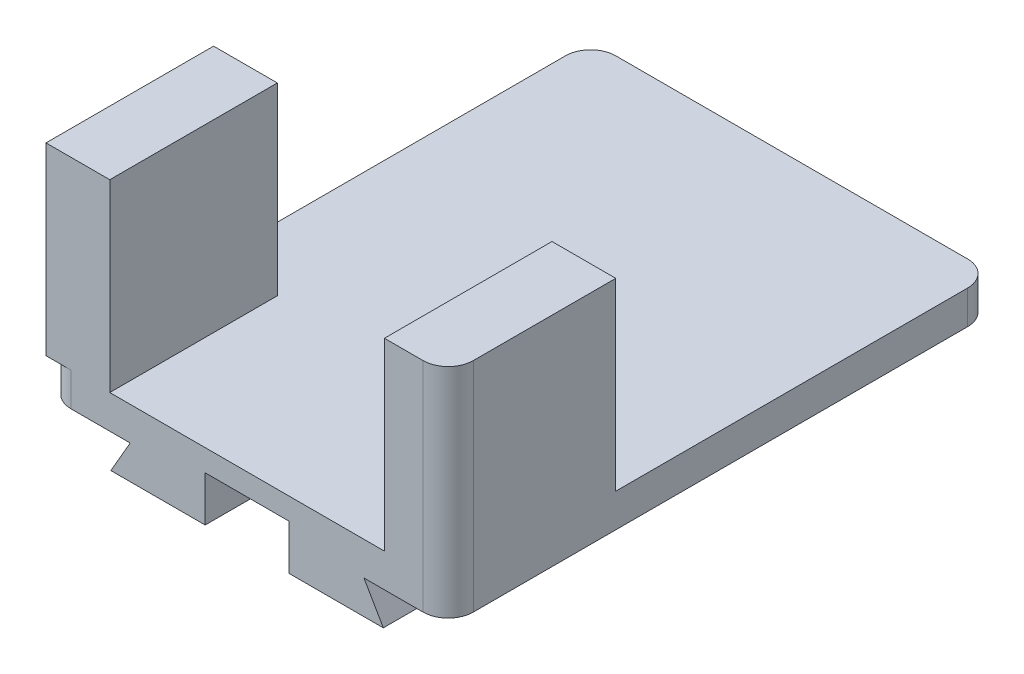
ISO-10303-21;
HEADER;
FILE_DESCRIPTION(('STEP AP214'),'2;1');
FILE_NAME('part.step','',(''),(''),'','','');
FILE_SCHEMA(('AUTOMOTIVE_DESIGN { 1 0 10303 214 1 1 1 1 }'));
ENDSEC;
DATA;
#1=APPLICATION_CONTEXT('core data for automotive mechanical design processes');
#2=APPLICATION_PROTOCOL_DEFINITION('international standard','automotive_design',2000,#1);
#3=PRODUCT_CONTEXT('',#1,'mechanical');
#4=PRODUCT('Part','Part','',(#3));
#5=PRODUCT_RELATED_PRODUCT_CATEGORY('part','',(#4));
#6=PRODUCT_DEFINITION_FORMATION('','',#4);
#7=PRODUCT_DEFINITION_CONTEXT('part definition',#1,'design');
#8=PRODUCT_DEFINITION('design','',#6,#7);
#9=PRODUCT_DEFINITION_SHAPE('','',#8);
#10=(LENGTH_UNIT() NAMED_UNIT(*) SI_UNIT(.MILLI.,.METRE.));
#11=(NAMED_UNIT(*) PLANE_ANGLE_UNIT() SI_UNIT($,.RADIAN.));
#12=(NAMED_UNIT(*) SI_UNIT($,.STERADIAN.) SOLID_ANGLE_UNIT());
#13=UNCERTAINTY_MEASURE_WITH_UNIT(LENGTH_MEASURE(1.E-05),#10,'distance_accuracy_value','');
#14=(GEOMETRIC_REPRESENTATION_CONTEXT(3) GLOBAL_UNCERTAINTY_ASSIGNED_CONTEXT((#13)) GLOBAL_UNIT_ASSIGNED_CONTEXT((#10,
#11,#12)) REPRESENTATION_CONTEXT('',''));
#15=CARTESIAN_POINT('',(0.,0.,0.));
#16=DIRECTION('',(0.,0.,1.));
#17=DIRECTION('',(1.,0.,0.));
#18=AXIS2_PLACEMENT_3D('',#15,#16,#17);
#19=CARTESIAN_POINT('',(0.,0.,82.55));
#20=DIRECTION('',(0.,-1.,0.));
#21=DIRECTION('',(0.,0.,-1.));
#22=AXIS2_PLACEMENT_3D('',#19,#20,#21);
#23=PLANE('',#22);
#24=DIRECTION('',(1.,0.,0.));
#25=VECTOR('',#24,1.);
#26=CARTESIAN_POINT('',(-30.48,0.,57.15));
#27=LINE('',#26,#25);
#28=CARTESIAN_POINT('',(-30.48,0.,57.15));
#29=VERTEX_POINT('',#28);
#30=CARTESIAN_POINT('',(-20.8153,0.,57.15));
#31=VERTEX_POINT('',#30);
#32=EDGE_CURVE('E48',#29,#31,#27,.T.);
#33=ORIENTED_EDGE('',*,*,#32,.T.);
#34=DIRECTION('',(0.,0.,1.));
#35=VECTOR('',#34,1.);
#36=CARTESIAN_POINT('',(-20.8153,0.,82.55));
#37=LINE('',#36,#35);
#38=CARTESIAN_POINT('',(-20.8153,0.,82.55));
#39=VERTEX_POINT('',#38);
#40=EDGE_CURVE('E223',#31,#39,#37,.T.);
#41=ORIENTED_EDGE('',*,*,#40,.T.);
#42=DIRECTION('',(-1.,0.,0.));
#43=VECTOR('',#42,1.);
#44=CARTESIAN_POINT('',(-30.48,0.,82.55));
#45=LINE('',#44,#43);
#46=CARTESIAN_POINT('',(20.8153,0.,82.55));
#47=VERTEX_POINT('',#46);
#48=EDGE_CURVE('E305',#47,#39,#45,.T.);
#49=ORIENTED_EDGE('',*,*,#48,.F.);
#50=DIRECTION('',(0.,0.,1.));
#51=VECTOR('',#50,1.);
#52=CARTESIAN_POINT('',(20.8153,0.,82.55));
#53=LINE('',#52,#51);
#54=CARTESIAN_POINT('',(20.8153,0.,57.15));
#55=VERTEX_POINT('',#54);
#56=EDGE_CURVE('E233',#55,#47,#53,.T.);
#57=ORIENTED_EDGE('',*,*,#56,.F.);
#58=DIRECTION('',(-1.,0.,0.));
#59=VECTOR('',#58,1.);
#60=CARTESIAN_POINT('',(30.48,0.,57.15));
#61=LINE('',#60,#59);
#62=CARTESIAN_POINT('',(30.48,0.,57.15));
#63=VERTEX_POINT('',#62);
#64=EDGE_CURVE('E198',#63,#55,#61,.T.);
#65=ORIENTED_EDGE('',*,*,#64,.F.);
#66=DIRECTION('',(0.,0.,-1.));
#67=VECTOR('',#66,1.);
#68=CARTESIAN_POINT('',(30.48,0.,82.55));
#69=LINE('',#68,#67);
#70=CARTESIAN_POINT('',(30.48,0.,3.80999999999999));
#71=VERTEX_POINT('',#70);
#72=EDGE_CURVE('E309',#63,#71,#69,.T.);
#73=ORIENTED_EDGE('',*,*,#72,.T.);
#74=CARTESIAN_POINT('',(26.67,0.,3.80999999999999));
#75=DIRECTION('',(0.,-1.,0.));
#76=DIRECTION('',(0.,0.,-1.));
#77=AXIS2_PLACEMENT_3D('',#74,#75,#76);
#78=CIRCLE('',#77,3.81);
#79=CARTESIAN_POINT('',(26.67,0.,0.));
#80=VERTEX_POINT('',#79);
#81=EDGE_CURVE('E277',#71,#80,#78,.F.);
#82=ORIENTED_EDGE('',*,*,#81,.T.);
#83=DIRECTION('',(-1.,0.,0.));
#84=VECTOR('',#83,1.);
#85=CARTESIAN_POINT('',(0.,0.,0.));
#86=LINE('',#85,#84);
#87=CARTESIAN_POINT('',(-26.67,0.,0.));
#88=VERTEX_POINT('',#87);
#89=EDGE_CURVE('E308',#80,#88,#86,.T.);
#90=ORIENTED_EDGE('',*,*,#89,.T.);
#91=CARTESIAN_POINT('',(-26.67,0.,3.80999999999999));
#92=DIRECTION('',(0.,-1.,0.));
#93=DIRECTION('',(0.,0.,-1.));
#94=AXIS2_PLACEMENT_3D('',#91,#92,#93);
#95=CIRCLE('',#94,3.81);
#96=CARTESIAN_POINT('',(-30.48,0.,3.80999999999999));
#97=VERTEX_POINT('',#96);
#98=EDGE_CURVE('E272',#88,#97,#95,.F.);
#99=ORIENTED_EDGE('',*,*,#98,.T.);
#100=DIRECTION('',(0.,0.,-1.));
#101=VECTOR('',#100,1.);
#102=CARTESIAN_POINT('',(-30.48,0.,82.55));
#103=LINE('',#102,#101);
#104=EDGE_CURVE('E53',#29,#97,#103,.T.);
#105=ORIENTED_EDGE('',*,*,#104,.F.);
#106=EDGE_LOOP('',(#33,#41,#49,#57,#65,#73,#82,#90,#99,#105));
#107=FACE_BOUND('',#106,.T.);
#108=ADVANCED_FACE('F33',(#107),#23,.F.);
#109=CARTESIAN_POINT('',(-30.48,-5.08,82.55));
#110=DIRECTION('',(1.,0.,0.));
#111=DIRECTION('',(0.,0.,-1.));
#112=AXIS2_PLACEMENT_3D('',#109,#110,#111);
#113=PLANE('',#112);
#114=DIRECTION('',(0.,0.,-1.));
#115=VECTOR('',#114,1.);
#116=CARTESIAN_POINT('',(-30.48,-5.08,82.55));
#117=LINE('',#116,#115);
#118=CARTESIAN_POINT('',(-30.48,-5.08,78.74));
#119=VERTEX_POINT('',#118);
#120=CARTESIAN_POINT('',(-30.48,-5.08,3.80999999999999));
#121=VERTEX_POINT('',#120);
#122=EDGE_CURVE('E289',#119,#121,#117,.T.);
#123=ORIENTED_EDGE('',*,*,#122,.F.);
#124=DIRECTION('',(0.,-1.,0.));
#125=VECTOR('',#124,1.);
#126=CARTESIAN_POINT('',(-30.48,-5.08,78.74));
#127=LINE('',#126,#125);
#128=CARTESIAN_POINT('',(-30.48,0.,78.74));
#129=VERTEX_POINT('',#128);
#130=EDGE_CURVE('E11',#119,#129,#127,.F.);
#131=ORIENTED_EDGE('',*,*,#130,.T.);
#132=DIRECTION('',(0.,0.,-1.));
#133=VECTOR('',#132,1.);
#134=CARTESIAN_POINT('',(-30.48,0.,82.55));
#135=LINE('',#134,#133);
#136=CARTESIAN_POINT('',(-30.48,0.,82.55));
#137=VERTEX_POINT('',#136);
#138=EDGE_CURVE('E194',#137,#129,#135,.T.);
#139=ORIENTED_EDGE('',*,*,#138,.F.);
#140=DIRECTION('',(0.,-1.,0.));
#141=VECTOR('',#140,1.);
#142=CARTESIAN_POINT('',(-30.48,27.94,82.55));
#143=LINE('',#142,#141);
#144=CARTESIAN_POINT('',(-30.48,27.94,82.55));
#145=VERTEX_POINT('',#144);
#146=EDGE_CURVE('E187',#145,#137,#143,.T.);
#147=ORIENTED_EDGE('',*,*,#146,.F.);
#148=DIRECTION('',(0.,0.,-1.));
#149=VECTOR('',#148,1.);
#150=CARTESIAN_POINT('',(-30.48,27.94,82.55));
#151=LINE('',#150,#149);
#152=CARTESIAN_POINT('',(-30.48,27.94,57.15));
#153=VERTEX_POINT('',#152);
#154=EDGE_CURVE('E191',#145,#153,#151,.T.);
#155=ORIENTED_EDGE('',*,*,#154,.T.);
#156=DIRECTION('',(0.,-1.,0.));
#157=VECTOR('',#156,1.);
#158=CARTESIAN_POINT('',(-30.48,27.94,57.15));
#159=LINE('',#158,#157);
#160=EDGE_CURVE('E219',#153,#29,#159,.T.);
#161=ORIENTED_EDGE('',*,*,#160,.T.);
#162=ORIENTED_EDGE('',*,*,#104,.T.);
#163=DIRECTION('',(0.,-1.,0.));
#164=VECTOR('',#163,1.);
#165=CARTESIAN_POINT('',(-30.48,-5.08,3.80999999999999));
#166=LINE('',#165,#164);
#167=EDGE_CURVE('E41',#97,#121,#166,.T.);
#168=ORIENTED_EDGE('',*,*,#167,.T.);
#169=EDGE_LOOP('',(#123,#131,#139,#147,#155,#161,#162,#168));
#170=FACE_BOUND('',#169,.T.);
#171=ADVANCED_FACE('F190',(#170),#113,.F.);
#172=CARTESIAN_POINT('',(-30.48,-5.08,82.55));
#173=DIRECTION('',(0.,1.,0.));
#174=DIRECTION('',(0.,0.,1.));
#175=AXIS2_PLACEMENT_3D('',#172,#173,#174);
#176=PLANE('',#175);
#177=DIRECTION('',(1.,0.,0.));
#178=VECTOR('',#177,1.);
#179=CARTESIAN_POINT('',(-30.48,-5.08,82.55));
#180=LINE('',#179,#178);
#181=CARTESIAN_POINT('',(-26.67,-5.08,82.55));
#182=VERTEX_POINT('',#181);
#183=CARTESIAN_POINT('',(-17.7172606325165,-5.08,82.55));
#184=VERTEX_POINT('',#183);
#185=EDGE_CURVE('E307',#182,#184,#180,.T.);
#186=ORIENTED_EDGE('',*,*,#185,.F.);
#187=CARTESIAN_POINT('',(-26.67,-5.08,78.74));
#188=DIRECTION('',(0.,1.,0.));
#189=DIRECTION('',(0.,0.,1.));
#190=AXIS2_PLACEMENT_3D('',#187,#188,#189);
#191=CIRCLE('',#190,3.81);
#192=EDGE_CURVE('E285',#182,#119,#191,.F.);
#193=ORIENTED_EDGE('',*,*,#192,.T.);
#194=ORIENTED_EDGE('',*,*,#122,.T.);
#195=CARTESIAN_POINT('',(-26.67,-5.08,3.80999999999999));
#196=DIRECTION('',(0.,1.,0.));
#197=DIRECTION('',(0.,0.,1.));
#198=AXIS2_PLACEMENT_3D('',#195,#196,#197);
#199=CIRCLE('',#198,3.81);
#200=CARTESIAN_POINT('',(-26.67,-5.08,0.));
#201=VERTEX_POINT('',#200);
#202=EDGE_CURVE('E283',#121,#201,#199,.F.);
#203=ORIENTED_EDGE('',*,*,#202,.T.);
#204=DIRECTION('',(1.,0.,0.));
#205=VECTOR('',#204,1.);
#206=CARTESIAN_POINT('',(-30.48,-5.08,0.));
#207=LINE('',#206,#205);
#208=CARTESIAN_POINT('',(-17.7172606325165,-5.08,0.));
#209=VERTEX_POINT('',#208);
#210=EDGE_CURVE('E331',#201,#209,#207,.T.);
#211=ORIENTED_EDGE('',*,*,#210,.T.);
#212=DIRECTION('',(0.,0.,-1.));
#213=VECTOR('',#212,1.);
#214=CARTESIAN_POINT('',(-17.7172606325165,-5.08,82.55));
#215=LINE('',#214,#213);
#216=EDGE_CURVE('E297',#184,#209,#215,.T.);
#217=ORIENTED_EDGE('',*,*,#216,.F.);
#218=EDGE_LOOP('',(#186,#193,#194,#203,#211,#217));
#219=FACE_BOUND('',#218,.T.);
#220=ADVANCED_FACE('F295',(#219),#176,.F.);
#221=CARTESIAN_POINT('',(-20.6502,-10.16,82.55));
#222=DIRECTION('',(0.866025403784423,-0.500000000000028,0.));
#223=DIRECTION('',(0.500000000000028,0.866025403784423,0.));
#224=AXIS2_PLACEMENT_3D('',#221,#222,#223);
#225=PLANE('',#224);
#226=DIRECTION('',(-0.500000000000028,-0.866025403784423,0.));
#227=VECTOR('',#226,1.);
#228=CARTESIAN_POINT('',(-20.6502,-10.16,0.));
#229=LINE('',#228,#227);
#230=CARTESIAN_POINT('',(-20.6502,-10.16,0.));
#231=VERTEX_POINT('',#230);
#232=EDGE_CURVE('E333',#209,#231,#229,.T.);
#233=ORIENTED_EDGE('',*,*,#232,.T.);
#234=DIRECTION('',(0.,0.,-1.));
#235=VECTOR('',#234,1.);
#236=CARTESIAN_POINT('',(-20.6502,-10.16,82.55));
#237=LINE('',#236,#235);
#238=CARTESIAN_POINT('',(-20.6502,-10.16,82.55));
#239=VERTEX_POINT('',#238);
#240=EDGE_CURVE('E301',#239,#231,#237,.T.);
#241=ORIENTED_EDGE('',*,*,#240,.F.);
#242=DIRECTION('',(-0.500000000000028,-0.866025403784423,0.));
#243=VECTOR('',#242,1.);
#244=CARTESIAN_POINT('',(-20.6502,-10.16,82.55));
#245=LINE('',#244,#243);
#246=EDGE_CURVE('E315',#184,#239,#245,.T.);
#247=ORIENTED_EDGE('',*,*,#246,.F.);
#248=ORIENTED_EDGE('',*,*,#216,.T.);
#249=EDGE_LOOP('',(#233,#241,#247,#248));
#250=FACE_BOUND('',#249,.T.);
#251=ADVANCED_FACE('F401',(#250),#225,.F.);
#252=CARTESIAN_POINT('',(-6.35,-10.16,82.55));
#253=DIRECTION('',(0.,1.,0.));
#254=DIRECTION('',(0.,0.,1.));
#255=AXIS2_PLACEMENT_3D('',#252,#253,#254);
#256=PLANE('',#255);
#257=DIRECTION('',(1.,0.,0.));
#258=VECTOR('',#257,1.);
#259=CARTESIAN_POINT('',(-6.35,-10.16,0.));
#260=LINE('',#259,#258);
#261=CARTESIAN_POINT('',(-6.35,-10.16,0.));
#262=VERTEX_POINT('',#261);
#263=EDGE_CURVE('E336',#231,#262,#260,.T.);
#264=ORIENTED_EDGE('',*,*,#263,.T.);
#265=DIRECTION('',(0.,0.,-1.));
#266=VECTOR('',#265,1.);
#267=CARTESIAN_POINT('',(-6.35,-10.16,82.55));
#268=LINE('',#267,#266);
#269=CARTESIAN_POINT('',(-6.35,-10.16,82.55));
#270=VERTEX_POINT('',#269);
#271=EDGE_CURVE('E372',#270,#262,#268,.T.);
#272=ORIENTED_EDGE('',*,*,#271,.F.);
#273=DIRECTION('',(1.,0.,0.));
#274=VECTOR('',#273,1.);
#275=CARTESIAN_POINT('',(-6.35,-10.16,82.55));
#276=LINE('',#275,#274);
#277=EDGE_CURVE('E317',#239,#270,#276,.T.);
#278=ORIENTED_EDGE('',*,*,#277,.F.);
#279=ORIENTED_EDGE('',*,*,#240,.T.);
#280=EDGE_LOOP('',(#264,#272,#278,#279));
#281=FACE_BOUND('',#280,.T.);
#282=ADVANCED_FACE('F379',(#281),#256,.F.);
#283=CARTESIAN_POINT('',(-6.35,-3.302,82.55));
#284=DIRECTION('',(-1.,0.,0.));
#285=DIRECTION('',(0.,-1.,0.));
#286=AXIS2_PLACEMENT_3D('',#283,#284,#285);
#287=PLANE('',#286);
#288=DIRECTION('',(0.,1.,0.));
#289=VECTOR('',#288,1.);
#290=CARTESIAN_POINT('',(-6.35,-3.302,0.));
#291=LINE('',#290,#289);
#292=CARTESIAN_POINT('',(-6.35,-3.302,0.));
#293=VERTEX_POINT('',#292);
#294=EDGE_CURVE('E338',#262,#293,#291,.T.);
#295=ORIENTED_EDGE('',*,*,#294,.T.);
#296=DIRECTION('',(0.,0.,-1.));
#297=VECTOR('',#296,1.);
#298=CARTESIAN_POINT('',(-6.35,-3.302,82.55));
#299=LINE('',#298,#297);
#300=CARTESIAN_POINT('',(-6.35,-3.302,82.55));
#301=VERTEX_POINT('',#300);
#302=EDGE_CURVE('E369',#301,#293,#299,.T.);
#303=ORIENTED_EDGE('',*,*,#302,.F.);
#304=DIRECTION('',(0.,1.,0.));
#305=VECTOR('',#304,1.);
#306=CARTESIAN_POINT('',(-6.35,-3.302,82.55));
#307=LINE('',#306,#305);
#308=EDGE_CURVE('E319',#270,#301,#307,.T.);
#309=ORIENTED_EDGE('',*,*,#308,.F.);
#310=ORIENTED_EDGE('',*,*,#271,.T.);
#311=EDGE_LOOP('',(#295,#303,#309,#310));
#312=FACE_BOUND('',#311,.T.);
#313=ADVANCED_FACE('F392',(#312),#287,.F.);
#314=CARTESIAN_POINT('',(6.35,-3.302,82.55));
#315=DIRECTION('',(0.,1.,0.));
#316=DIRECTION('',(-1.,0.,0.));
#317=AXIS2_PLACEMENT_3D('',#314,#315,#316);
#318=PLANE('',#317);
#319=DIRECTION('',(1.,0.,0.));
#320=VECTOR('',#319,1.);
#321=CARTESIAN_POINT('',(6.35,-3.302,0.));
#322=LINE('',#321,#320);
#323=CARTESIAN_POINT('',(6.35,-3.302,0.));
#324=VERTEX_POINT('',#323);
#325=EDGE_CURVE('E340',#293,#324,#322,.T.);
#326=ORIENTED_EDGE('',*,*,#325,.T.);
#327=DIRECTION('',(0.,0.,-1.));
#328=VECTOR('',#327,1.);
#329=CARTESIAN_POINT('',(6.35,-3.302,82.55));
#330=LINE('',#329,#328);
#331=CARTESIAN_POINT('',(6.35,-3.302,82.55));
#332=VERTEX_POINT('',#331);
#333=EDGE_CURVE('E366',#332,#324,#330,.T.);
#334=ORIENTED_EDGE('',*,*,#333,.F.);
#335=DIRECTION('',(1.,0.,0.));
#336=VECTOR('',#335,1.);
#337=CARTESIAN_POINT('',(6.35,-3.302,82.55));
#338=LINE('',#337,#336);
#339=EDGE_CURVE('E321',#301,#332,#338,.T.);
#340=ORIENTED_EDGE('',*,*,#339,.F.);
#341=ORIENTED_EDGE('',*,*,#302,.T.);
#342=EDGE_LOOP('',(#326,#334,#340,#341));
#343=FACE_BOUND('',#342,.T.);
#344=ADVANCED_FACE('F396',(#343),#318,.F.);
#345=CARTESIAN_POINT('',(6.35,-10.16,82.55));
#346=DIRECTION('',(1.,0.,0.));
#347=DIRECTION('',(0.,0.,-1.));
#348=AXIS2_PLACEMENT_3D('',#345,#346,#347);
#349=PLANE('',#348);
#350=DIRECTION('',(0.,-1.,0.));
#351=VECTOR('',#350,1.);
#352=CARTESIAN_POINT('',(6.35,-10.16,0.));
#353=LINE('',#352,#351);
#354=CARTESIAN_POINT('',(6.35,-10.16,0.));
#355=VERTEX_POINT('',#354);
#356=EDGE_CURVE('E342',#324,#355,#353,.T.);
#357=ORIENTED_EDGE('',*,*,#356,.T.);
#358=DIRECTION('',(0.,0.,-1.));
#359=VECTOR('',#358,1.);
#360=CARTESIAN_POINT('',(6.35,-10.16,82.55));
#361=LINE('',#360,#359);
#362=CARTESIAN_POINT('',(6.35,-10.16,82.55));
#363=VERTEX_POINT('',#362);
#364=EDGE_CURVE('E363',#363,#355,#361,.T.);
#365=ORIENTED_EDGE('',*,*,#364,.F.);
#366=DIRECTION('',(0.,-1.,0.));
#367=VECTOR('',#366,1.);
#368=CARTESIAN_POINT('',(6.35,-10.16,82.55));
#369=LINE('',#368,#367);
#370=EDGE_CURVE('E323',#332,#363,#369,.T.);
#371=ORIENTED_EDGE('',*,*,#370,.F.);
#372=ORIENTED_EDGE('',*,*,#333,.T.);
#373=EDGE_LOOP('',(#357,#365,#371,#372));
#374=FACE_BOUND('',#373,.T.);
#375=ADVANCED_FACE('F436',(#374),#349,.F.);
#376=CARTESIAN_POINT('',(20.6502,-10.16,82.55));
#377=DIRECTION('',(0.,1.,0.));
#378=DIRECTION('',(0.,0.,1.));
#379=AXIS2_PLACEMENT_3D('',#376,#377,#378);
#380=PLANE('',#379);
#381=DIRECTION('',(1.,0.,0.));
#382=VECTOR('',#381,1.);
#383=CARTESIAN_POINT('',(20.6502,-10.16,0.));
#384=LINE('',#383,#382);
#385=CARTESIAN_POINT('',(20.6502,-10.16,0.));
#386=VERTEX_POINT('',#385);
#387=EDGE_CURVE('E344',#355,#386,#384,.T.);
#388=ORIENTED_EDGE('',*,*,#387,.T.);
#389=DIRECTION('',(0.,0.,-1.));
#390=VECTOR('',#389,1.);
#391=CARTESIAN_POINT('',(20.6502,-10.16,82.55));
#392=LINE('',#391,#390);
#393=CARTESIAN_POINT('',(20.6502,-10.16,82.55));
#394=VERTEX_POINT('',#393);
#395=EDGE_CURVE('E360',#394,#386,#392,.T.);
#396=ORIENTED_EDGE('',*,*,#395,.F.);
#397=DIRECTION('',(1.,0.,0.));
#398=VECTOR('',#397,1.);
#399=CARTESIAN_POINT('',(20.6502,-10.16,82.55));
#400=LINE('',#399,#398);
#401=EDGE_CURVE('E325',#363,#394,#400,.T.);
#402=ORIENTED_EDGE('',*,*,#401,.F.);
#403=ORIENTED_EDGE('',*,*,#364,.T.);
#404=EDGE_LOOP('',(#388,#396,#402,#403));
#405=FACE_BOUND('',#404,.T.);
#406=ADVANCED_FACE('F434',(#405),#380,.F.);
#407=CARTESIAN_POINT('',(17.7172606325165,-5.08,82.55));
#408=DIRECTION('',(-0.866025403784423,-0.500000000000028,0.));
#409=DIRECTION('',(0.500000000000028,-0.866025403784423,0.));
#410=AXIS2_PLACEMENT_3D('',#407,#408,#409);
#411=PLANE('',#410);
#412=DIRECTION('',(-0.500000000000028,0.866025403784423,0.));
#413=VECTOR('',#412,1.);
#414=CARTESIAN_POINT('',(17.7172606325165,-5.08,0.));
#415=LINE('',#414,#413);
#416=CARTESIAN_POINT('',(17.7172606325165,-5.08,0.));
#417=VERTEX_POINT('',#416);
#418=EDGE_CURVE('E346',#386,#417,#415,.T.);
#419=ORIENTED_EDGE('',*,*,#418,.T.);
#420=DIRECTION('',(0.,0.,-1.));
#421=VECTOR('',#420,1.);
#422=CARTESIAN_POINT('',(17.7172606325165,-5.08,82.55));
#423=LINE('',#422,#421);
#424=CARTESIAN_POINT('',(17.7172606325165,-5.08,82.55));
#425=VERTEX_POINT('',#424);
#426=EDGE_CURVE('E357',#425,#417,#423,.T.);
#427=ORIENTED_EDGE('',*,*,#426,.F.);
#428=DIRECTION('',(-0.500000000000028,0.866025403784423,0.));
#429=VECTOR('',#428,1.);
#430=CARTESIAN_POINT('',(17.7172606325165,-5.08,82.55));
#431=LINE('',#430,#429);
#432=EDGE_CURVE('E327',#394,#425,#431,.T.);
#433=ORIENTED_EDGE('',*,*,#432,.F.);
#434=ORIENTED_EDGE('',*,*,#395,.T.);
#435=EDGE_LOOP('',(#419,#427,#433,#434));
#436=FACE_BOUND('',#435,.T.);
#437=ADVANCED_FACE('F430',(#436),#411,.F.);
#438=CARTESIAN_POINT('',(17.7172606325165,-5.08,82.55));
#439=DIRECTION('',(0.,1.,0.));
#440=DIRECTION('',(0.,0.,1.));
#441=AXIS2_PLACEMENT_3D('',#438,#439,#440);
#442=PLANE('',#441);
#443=DIRECTION('',(0.,0.,-1.));
#444=VECTOR('',#443,1.);
#445=CARTESIAN_POINT('',(30.48,-5.08,82.55));
#446=LINE('',#445,#444);
#447=CARTESIAN_POINT('',(30.48,-5.08,78.74));
#448=VERTEX_POINT('',#447);
#449=CARTESIAN_POINT('',(30.48,-5.08,3.80999999999999));
#450=VERTEX_POINT('',#449);
#451=EDGE_CURVE('E354',#448,#450,#446,.T.);
#452=ORIENTED_EDGE('',*,*,#451,.F.);
#453=CARTESIAN_POINT('',(26.67,-5.08,78.74));
#454=DIRECTION('',(0.,1.,0.));
#455=DIRECTION('',(0.,0.,1.));
#456=AXIS2_PLACEMENT_3D('',#453,#454,#455);
#457=CIRCLE('',#456,3.81);
#458=CARTESIAN_POINT('',(26.67,-5.08,82.55));
#459=VERTEX_POINT('',#458);
#460=EDGE_CURVE('E270',#448,#459,#457,.F.);
#461=ORIENTED_EDGE('',*,*,#460,.T.);
#462=DIRECTION('',(1.,0.,0.));
#463=VECTOR('',#462,1.);
#464=CARTESIAN_POINT('',(17.7172606325165,-5.08,82.55));
#465=LINE('',#464,#463);
#466=EDGE_CURVE('E329',#425,#459,#465,.T.);
#467=ORIENTED_EDGE('',*,*,#466,.F.);
#468=ORIENTED_EDGE('',*,*,#426,.T.);
#469=DIRECTION('',(1.,0.,0.));
#470=VECTOR('',#469,1.);
#471=CARTESIAN_POINT('',(17.7172606325165,-5.08,0.));
#472=LINE('',#471,#470);
#473=CARTESIAN_POINT('',(26.67,-5.08,0.));
#474=VERTEX_POINT('',#473);
#475=EDGE_CURVE('E348',#417,#474,#472,.T.);
#476=ORIENTED_EDGE('',*,*,#475,.T.);
#477=CARTESIAN_POINT('',(26.67,-5.08,3.80999999999999));
#478=DIRECTION('',(0.,1.,0.));
#479=DIRECTION('',(0.,0.,1.));
#480=AXIS2_PLACEMENT_3D('',#477,#478,#479);
#481=CIRCLE('',#480,3.81);
#482=EDGE_CURVE('E268',#474,#450,#481,.F.);
#483=ORIENTED_EDGE('',*,*,#482,.T.);
#484=EDGE_LOOP('',(#452,#461,#467,#468,#476,#483));
#485=FACE_BOUND('',#484,.T.);
#486=ADVANCED_FACE('F412',(#485),#442,.F.);
#487=CARTESIAN_POINT('',(30.48,0.,82.55));
#488=DIRECTION('',(-1.,0.,0.));
#489=DIRECTION('',(0.,0.,1.));
#490=AXIS2_PLACEMENT_3D('',#487,#488,#489);
#491=PLANE('',#490);
#492=DIRECTION('',(0.,0.,-1.));
#493=VECTOR('',#492,1.);
#494=CARTESIAN_POINT('',(30.48,27.94,82.55));
#495=LINE('',#494,#493);
#496=CARTESIAN_POINT('',(30.48,27.94,78.74));
#497=VERTEX_POINT('',#496);
#498=CARTESIAN_POINT('',(30.48,27.94,57.15));
#499=VERTEX_POINT('',#498);
#500=EDGE_CURVE('E230',#497,#499,#495,.T.);
#501=ORIENTED_EDGE('',*,*,#500,.F.);
#502=DIRECTION('',(0.,1.,0.));
#503=VECTOR('',#502,1.);
#504=CARTESIAN_POINT('',(30.48,0.,78.74));
#505=LINE('',#504,#503);
#506=EDGE_CURVE('E266',#497,#448,#505,.F.);
#507=ORIENTED_EDGE('',*,*,#506,.T.);
#508=ORIENTED_EDGE('',*,*,#451,.T.);
#509=DIRECTION('',(0.,1.,0.));
#510=VECTOR('',#509,1.);
#511=CARTESIAN_POINT('',(30.48,0.,3.80999999999999));
#512=LINE('',#511,#510);
#513=EDGE_CURVE('E263',#450,#71,#512,.T.);
#514=ORIENTED_EDGE('',*,*,#513,.T.);
#515=ORIENTED_EDGE('',*,*,#72,.F.);
#516=DIRECTION('',(0.,-1.,0.));
#517=VECTOR('',#516,1.);
#518=CARTESIAN_POINT('',(30.48,27.94,57.15));
#519=LINE('',#518,#517);
#520=EDGE_CURVE('E334',#499,#63,#519,.T.);
#521=ORIENTED_EDGE('',*,*,#520,.F.);
#522=EDGE_LOOP('',(#501,#507,#508,#514,#515,#521));
#523=FACE_BOUND('',#522,.T.);
#524=ADVANCED_FACE('F416',(#523),#491,.F.);
#525=CARTESIAN_POINT('',(30.48,0.,82.55));
#526=DIRECTION('',(0.,0.,-1.));
#527=DIRECTION('',(-1.,0.,0.));
#528=AXIS2_PLACEMENT_3D('',#525,#526,#527);
#529=PLANE('',#528);
#530=ORIENTED_EDGE('',*,*,#466,.T.);
#531=DIRECTION('',(0.,1.,0.));
#532=VECTOR('',#531,1.);
#533=CARTESIAN_POINT('',(26.67,0.,82.55));
#534=LINE('',#533,#532);
#535=CARTESIAN_POINT('',(26.67,27.94,82.55));
#536=VERTEX_POINT('',#535);
#537=EDGE_CURVE('E258',#459,#536,#534,.T.);
#538=ORIENTED_EDGE('',*,*,#537,.T.);
#539=DIRECTION('',(1.,0.,0.));
#540=VECTOR('',#539,1.);
#541=CARTESIAN_POINT('',(30.48,27.94,82.55));
#542=LINE('',#541,#540);
#543=CARTESIAN_POINT('',(20.8153,27.94,82.55));
#544=VERTEX_POINT('',#543);
#545=EDGE_CURVE('E237',#544,#536,#542,.T.);
#546=ORIENTED_EDGE('',*,*,#545,.F.);
#547=DIRECTION('',(0.,-1.,0.));
#548=VECTOR('',#547,1.);
#549=CARTESIAN_POINT('',(20.8153,27.94,82.55));
#550=LINE('',#549,#548);
#551=EDGE_CURVE('E240',#544,#47,#550,.T.);
#552=ORIENTED_EDGE('',*,*,#551,.T.);
#553=ORIENTED_EDGE('',*,*,#48,.T.);
#554=DIRECTION('',(0.,-1.,0.));
#555=VECTOR('',#554,1.);
#556=CARTESIAN_POINT('',(-20.8153,27.94,82.55));
#557=LINE('',#556,#555);
#558=CARTESIAN_POINT('',(-20.8153,27.94,82.55));
#559=VERTEX_POINT('',#558);
#560=EDGE_CURVE('E199',#559,#39,#557,.T.);
#561=ORIENTED_EDGE('',*,*,#560,.F.);
#562=DIRECTION('',(-1.,0.,0.));
#563=VECTOR('',#562,1.);
#564=CARTESIAN_POINT('',(-30.48,27.94,82.55));
#565=LINE('',#564,#563);
#566=EDGE_CURVE('E205',#559,#145,#565,.T.);
#567=ORIENTED_EDGE('',*,*,#566,.T.);
#568=ORIENTED_EDGE('',*,*,#146,.T.);
#569=DIRECTION('',(-1.,0.,0.));
#570=VECTOR('',#569,1.);
#571=CARTESIAN_POINT('',(-30.48,0.,82.55));
#572=LINE('',#571,#570);
#573=CARTESIAN_POINT('',(-26.67,0.,82.55));
#574=VERTEX_POINT('',#573);
#575=EDGE_CURVE('E221',#574,#137,#572,.T.);
#576=ORIENTED_EDGE('',*,*,#575,.F.);
#577=DIRECTION('',(0.,-1.,0.));
#578=VECTOR('',#577,1.);
#579=CARTESIAN_POINT('',(-26.67,0.,82.55));
#580=LINE('',#579,#578);
#581=EDGE_CURVE('E255',#574,#182,#580,.T.);
#582=ORIENTED_EDGE('',*,*,#581,.T.);
#583=ORIENTED_EDGE('',*,*,#185,.T.);
#584=ORIENTED_EDGE('',*,*,#246,.T.);
#585=ORIENTED_EDGE('',*,*,#277,.T.);
#586=ORIENTED_EDGE('',*,*,#308,.T.);
#587=ORIENTED_EDGE('',*,*,#339,.T.);
#588=ORIENTED_EDGE('',*,*,#370,.T.);
#589=ORIENTED_EDGE('',*,*,#401,.T.);
#590=ORIENTED_EDGE('',*,*,#432,.T.);
#591=EDGE_LOOP('',(#530,#538,#546,#552,#553,#561,#567,#568,#576,#582,#583,#584,#585,#586,#587,
#588,#589,#590));
#592=FACE_BOUND('',#591,.T.);
#593=ADVANCED_FACE('F211',(#592),#529,.F.);
#594=CARTESIAN_POINT('',(30.48,0.,0.));
#595=DIRECTION('',(0.,0.,-1.));
#596=DIRECTION('',(-1.,0.,0.));
#597=AXIS2_PLACEMENT_3D('',#594,#595,#596);
#598=PLANE('',#597);
#599=ORIENTED_EDGE('',*,*,#89,.F.);
#600=DIRECTION('',(0.,1.,0.));
#601=VECTOR('',#600,1.);
#602=CARTESIAN_POINT('',(26.67,-5.08,0.));
#603=LINE('',#602,#601);
#604=EDGE_CURVE('E281',#80,#474,#603,.F.);
#605=ORIENTED_EDGE('',*,*,#604,.T.);
#606=ORIENTED_EDGE('',*,*,#475,.F.);
#607=ORIENTED_EDGE('',*,*,#418,.F.);
#608=ORIENTED_EDGE('',*,*,#387,.F.);
#609=ORIENTED_EDGE('',*,*,#356,.F.);
#610=ORIENTED_EDGE('',*,*,#325,.F.);
#611=ORIENTED_EDGE('',*,*,#294,.F.);
#612=ORIENTED_EDGE('',*,*,#263,.F.);
#613=ORIENTED_EDGE('',*,*,#232,.F.);
#614=ORIENTED_EDGE('',*,*,#210,.F.);
#615=DIRECTION('',(0.,-1.,0.));
#616=VECTOR('',#615,1.);
#617=CARTESIAN_POINT('',(-26.67,0.,0.));
#618=LINE('',#617,#616);
#619=EDGE_CURVE('E279',#201,#88,#618,.F.);
#620=ORIENTED_EDGE('',*,*,#619,.T.);
#621=EDGE_LOOP('',(#599,#605,#606,#607,#608,#609,#610,#611,#612,#613,#614,#620));
#622=FACE_BOUND('',#621,.T.);
#623=ADVANCED_FACE('F387',(#622),#598,.T.);
#624=CARTESIAN_POINT('',(30.48,27.94,57.15));
#625=DIRECTION('',(0.,0.,1.));
#626=DIRECTION('',(1.,0.,0.));
#627=AXIS2_PLACEMENT_3D('',#624,#625,#626);
#628=PLANE('',#627);
#629=ORIENTED_EDGE('',*,*,#64,.T.);
#630=DIRECTION('',(0.,-1.,0.));
#631=VECTOR('',#630,1.);
#632=CARTESIAN_POINT('',(20.8153,27.94,57.15));
#633=LINE('',#632,#631);
#634=CARTESIAN_POINT('',(20.8153,27.94,57.15));
#635=VERTEX_POINT('',#634);
#636=EDGE_CURVE('E243',#635,#55,#633,.T.);
#637=ORIENTED_EDGE('',*,*,#636,.F.);
#638=DIRECTION('',(-1.,0.,0.));
#639=VECTOR('',#638,1.);
#640=CARTESIAN_POINT('',(30.48,27.94,57.15));
#641=LINE('',#640,#639);
#642=EDGE_CURVE('E232',#499,#635,#641,.T.);
#643=ORIENTED_EDGE('',*,*,#642,.F.);
#644=ORIENTED_EDGE('',*,*,#520,.T.);
#645=EDGE_LOOP('',(#629,#637,#643,#644));
#646=FACE_BOUND('',#645,.T.);
#647=ADVANCED_FACE('F486',(#646),#628,.F.);
#648=CARTESIAN_POINT('',(20.8153,27.94,82.55));
#649=DIRECTION('',(1.,0.,0.));
#650=DIRECTION('',(0.,0.,-1.));
#651=AXIS2_PLACEMENT_3D('',#648,#649,#650);
#652=PLANE('',#651);
#653=ORIENTED_EDGE('',*,*,#56,.T.);
#654=ORIENTED_EDGE('',*,*,#551,.F.);
#655=DIRECTION('',(0.,0.,1.));
#656=VECTOR('',#655,1.);
#657=CARTESIAN_POINT('',(20.8153,27.94,82.55));
#658=LINE('',#657,#656);
#659=EDGE_CURVE('E235',#635,#544,#658,.T.);
#660=ORIENTED_EDGE('',*,*,#659,.F.);
#661=ORIENTED_EDGE('',*,*,#636,.T.);
#662=EDGE_LOOP('',(#653,#654,#660,#661));
#663=FACE_BOUND('',#662,.T.);
#664=ADVANCED_FACE('F492',(#663),#652,.F.);
#665=CARTESIAN_POINT('',(30.48,27.94,57.15));
#666=DIRECTION('',(0.,1.,0.));
#667=DIRECTION('',(0.,0.,1.));
#668=AXIS2_PLACEMENT_3D('',#665,#666,#667);
#669=PLANE('',#668);
#670=ORIENTED_EDGE('',*,*,#545,.T.);
#671=CARTESIAN_POINT('',(26.67,27.94,78.74));
#672=DIRECTION('',(0.,1.,0.));
#673=DIRECTION('',(0.,0.,1.));
#674=AXIS2_PLACEMENT_3D('',#671,#672,#673);
#675=CIRCLE('',#674,3.81);
#676=EDGE_CURVE('E261',#536,#497,#675,.T.);
#677=ORIENTED_EDGE('',*,*,#676,.T.);
#678=ORIENTED_EDGE('',*,*,#500,.T.);
#679=ORIENTED_EDGE('',*,*,#642,.T.);
#680=ORIENTED_EDGE('',*,*,#659,.T.);
#681=EDGE_LOOP('',(#670,#677,#678,#679,#680));
#682=FACE_BOUND('',#681,.T.);
#683=ADVANCED_FACE('F500',(#682),#669,.T.);
#684=CARTESIAN_POINT('',(26.67,0.,78.74));
#685=DIRECTION('',(0.,1.,0.));
#686=DIRECTION('',(0.,0.,1.));
#687=AXIS2_PLACEMENT_3D('',#684,#685,#686);
#688=CYLINDRICAL_SURFACE('',#687,3.81);
#689=ORIENTED_EDGE('',*,*,#460,.F.);
#690=ORIENTED_EDGE('',*,*,#506,.F.);
#691=ORIENTED_EDGE('',*,*,#676,.F.);
#692=ORIENTED_EDGE('',*,*,#537,.F.);
#693=EDGE_LOOP('',(#689,#690,#691,#692));
#694=FACE_BOUND('',#693,.T.);
#695=ADVANCED_FACE('F421',(#694),#688,.T.);
#696=CARTESIAN_POINT('',(26.67,0.,3.80999999999999));
#697=DIRECTION('',(0.,-1.,0.));
#698=DIRECTION('',(0.,0.,-1.));
#699=AXIS2_PLACEMENT_3D('',#696,#697,#698);
#700=CYLINDRICAL_SURFACE('',#699,3.81);
#701=ORIENTED_EDGE('',*,*,#482,.F.);
#702=ORIENTED_EDGE('',*,*,#604,.F.);
#703=ORIENTED_EDGE('',*,*,#81,.F.);
#704=ORIENTED_EDGE('',*,*,#513,.F.);
#705=EDGE_LOOP('',(#701,#702,#703,#704));
#706=FACE_BOUND('',#705,.T.);
#707=ADVANCED_FACE('F408',(#706),#700,.T.);
#708=CARTESIAN_POINT('',(-26.67,0.,78.74));
#709=DIRECTION('',(0.,-1.,0.));
#710=DIRECTION('',(0.,0.,-1.));
#711=AXIS2_PLACEMENT_3D('',#708,#709,#710);
#712=CYLINDRICAL_SURFACE('',#711,3.81);
#713=CARTESIAN_POINT('',(-26.67,0.,78.74));
#714=DIRECTION('',(0.,-1.,0.));
#715=DIRECTION('',(0.,0.,-1.));
#716=AXIS2_PLACEMENT_3D('',#713,#714,#715);
#717=CIRCLE('',#716,3.81);
#718=EDGE_CURVE('E274',#129,#574,#717,.F.);
#719=ORIENTED_EDGE('',*,*,#718,.F.);
#720=ORIENTED_EDGE('',*,*,#130,.F.);
#721=ORIENTED_EDGE('',*,*,#192,.F.);
#722=ORIENTED_EDGE('',*,*,#581,.F.);
#723=EDGE_LOOP('',(#719,#720,#721,#722));
#724=FACE_BOUND('',#723,.T.);
#725=ADVANCED_FACE('F520',(#724),#712,.T.);
#726=CARTESIAN_POINT('',(-26.67,-5.08,3.80999999999999));
#727=DIRECTION('',(0.,1.,0.));
#728=DIRECTION('',(0.,0.,1.));
#729=AXIS2_PLACEMENT_3D('',#726,#727,#728);
#730=CYLINDRICAL_SURFACE('',#729,3.81);
#731=ORIENTED_EDGE('',*,*,#98,.F.);
#732=ORIENTED_EDGE('',*,*,#619,.F.);
#733=ORIENTED_EDGE('',*,*,#202,.F.);
#734=ORIENTED_EDGE('',*,*,#167,.F.);
#735=EDGE_LOOP('',(#731,#732,#733,#734));
#736=FACE_BOUND('',#735,.T.);
#737=ADVANCED_FACE('F35',(#736),#730,.T.);
#738=CARTESIAN_POINT('',(-20.8153,27.94,82.55));
#739=DIRECTION('',(1.,0.,0.));
#740=DIRECTION('',(0.,0.,-1.));
#741=AXIS2_PLACEMENT_3D('',#738,#739,#740);
#742=PLANE('',#741);
#743=ORIENTED_EDGE('',*,*,#40,.F.);
#744=DIRECTION('',(0.,-1.,0.));
#745=VECTOR('',#744,1.);
#746=CARTESIAN_POINT('',(-20.8153,27.94,57.15));
#747=LINE('',#746,#745);
#748=CARTESIAN_POINT('',(-20.8153,27.94,57.15));
#749=VERTEX_POINT('',#748);
#750=EDGE_CURVE('E227',#749,#31,#747,.T.);
#751=ORIENTED_EDGE('',*,*,#750,.F.);
#752=DIRECTION('',(0.,0.,1.));
#753=VECTOR('',#752,1.);
#754=CARTESIAN_POINT('',(-20.8153,27.94,82.55));
#755=LINE('',#754,#753);
#756=EDGE_CURVE('E214',#749,#559,#755,.T.);
#757=ORIENTED_EDGE('',*,*,#756,.T.);
#758=ORIENTED_EDGE('',*,*,#560,.T.);
#759=EDGE_LOOP('',(#743,#751,#757,#758));
#760=FACE_BOUND('',#759,.T.);
#761=ADVANCED_FACE('F533',(#760),#742,.T.);
#762=CARTESIAN_POINT('',(-30.48,27.94,57.15));
#763=DIRECTION('',(0.,0.,-1.));
#764=DIRECTION('',(-1.,0.,0.));
#765=AXIS2_PLACEMENT_3D('',#762,#763,#764);
#766=PLANE('',#765);
#767=ORIENTED_EDGE('',*,*,#32,.F.);
#768=ORIENTED_EDGE('',*,*,#160,.F.);
#769=DIRECTION('',(1.,0.,0.));
#770=VECTOR('',#769,1.);
#771=CARTESIAN_POINT('',(-30.48,27.94,57.15));
#772=LINE('',#771,#770);
#773=EDGE_CURVE('E208',#153,#749,#772,.T.);
#774=ORIENTED_EDGE('',*,*,#773,.T.);
#775=ORIENTED_EDGE('',*,*,#750,.T.);
#776=EDGE_LOOP('',(#767,#768,#774,#775));
#777=FACE_BOUND('',#776,.T.);
#778=ADVANCED_FACE('F538',(#777),#766,.T.);
#779=CARTESIAN_POINT('',(-30.48,27.94,57.15));
#780=DIRECTION('',(0.,1.,0.));
#781=DIRECTION('',(0.,0.,1.));
#782=AXIS2_PLACEMENT_3D('',#779,#780,#781);
#783=PLANE('',#782);
#784=ORIENTED_EDGE('',*,*,#154,.F.);
#785=ORIENTED_EDGE('',*,*,#566,.F.);
#786=ORIENTED_EDGE('',*,*,#756,.F.);
#787=ORIENTED_EDGE('',*,*,#773,.F.);
#788=EDGE_LOOP('',(#784,#785,#786,#787));
#789=FACE_BOUND('',#788,.T.);
#790=ADVANCED_FACE('F203',(#789),#783,.T.);
#791=CARTESIAN_POINT('',(-30.48,0.,57.15));
#792=DIRECTION('',(0.,1.,0.));
#793=DIRECTION('',(0.,0.,1.));
#794=AXIS2_PLACEMENT_3D('',#791,#792,#793);
#795=PLANE('',#794);
#796=ORIENTED_EDGE('',*,*,#718,.T.);
#797=ORIENTED_EDGE('',*,*,#575,.T.);
#798=ORIENTED_EDGE('',*,*,#138,.T.);
#799=EDGE_LOOP('',(#796,#797,#798));
#800=FACE_BOUND('',#799,.T.);
#801=ADVANCED_FACE('F553',(#800),#795,.F.);
#802=CLOSED_SHELL('',(#108,#171,#220,#251,#282,#313,#344,#375,#406,#437,#486,#524,#593,#623,
#647,#664,#683,#695,#707,#725,#737,#761,#778,#790,#801));
#803=MANIFOLD_SOLID_BREP('B2',#802);
#804=ADVANCED_BREP_SHAPE_REPRESENTATION('',(#18,#803),#14);
#805=SHAPE_DEFINITION_REPRESENTATION(#9,#804);
ENDSEC;
END-ISO-10303-21;
